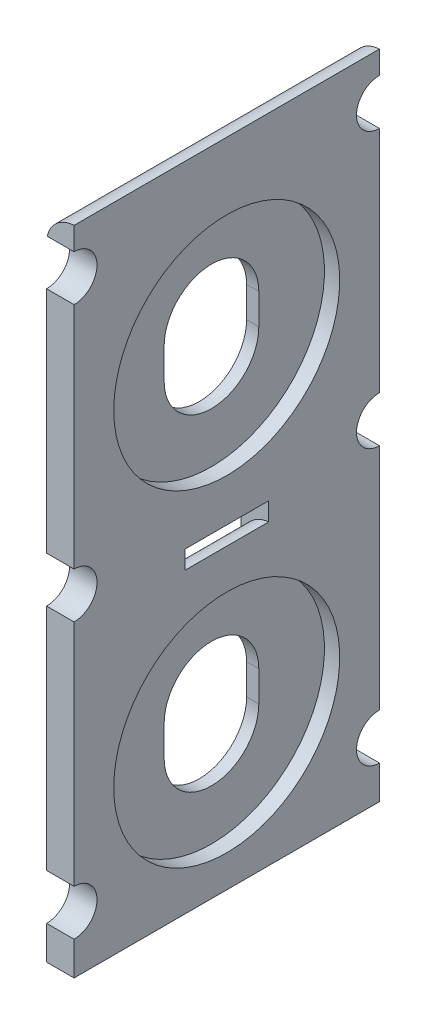
ISO-10303-21;
HEADER;
FILE_DESCRIPTION(('STEP AP214'),'2;1');
FILE_NAME('part.step','',(''),(''),'','','');
FILE_SCHEMA(('AUTOMOTIVE_DESIGN { 1 0 10303 214 1 1 1 1 }'));
ENDSEC;
DATA;
#1=APPLICATION_CONTEXT('core data for automotive mechanical design processes');
#2=APPLICATION_PROTOCOL_DEFINITION('international standard','automotive_design',2000,#1);
#3=PRODUCT_CONTEXT('',#1,'mechanical');
#4=PRODUCT('Part','Part','',(#3));
#5=PRODUCT_RELATED_PRODUCT_CATEGORY('part','',(#4));
#6=PRODUCT_DEFINITION_FORMATION('','',#4);
#7=PRODUCT_DEFINITION_CONTEXT('part definition',#1,'design');
#8=PRODUCT_DEFINITION('design','',#6,#7);
#9=PRODUCT_DEFINITION_SHAPE('','',#8);
#10=(LENGTH_UNIT() NAMED_UNIT(*) SI_UNIT(.MILLI.,.METRE.));
#11=(NAMED_UNIT(*) PLANE_ANGLE_UNIT() SI_UNIT($,.RADIAN.));
#12=(NAMED_UNIT(*) SI_UNIT($,.STERADIAN.) SOLID_ANGLE_UNIT());
#13=UNCERTAINTY_MEASURE_WITH_UNIT(LENGTH_MEASURE(1.E-05),#10,'distance_accuracy_value','');
#14=(GEOMETRIC_REPRESENTATION_CONTEXT(3) GLOBAL_UNCERTAINTY_ASSIGNED_CONTEXT((#13)) GLOBAL_UNIT_ASSIGNED_CONTEXT((#10,
#11,#12)) REPRESENTATION_CONTEXT('',''));
#15=CARTESIAN_POINT('',(0.,0.,0.));
#16=DIRECTION('',(0.,0.,1.));
#17=DIRECTION('',(1.,0.,0.));
#18=AXIS2_PLACEMENT_3D('',#15,#16,#17);
#19=CARTESIAN_POINT('',(24.7777685642343,171.879145763423,34.5));
#20=DIRECTION('',(0.,0.,-1.));
#21=DIRECTION('',(1.,0.,0.));
#22=AXIS2_PLACEMENT_3D('',#19,#20,#21);
#23=PLANE('',#22);
#24=DIRECTION('',(0.,1.,0.));
#25=VECTOR('',#24,1.);
#26=CARTESIAN_POINT('',(24.7777685642343,171.879145763423,34.5));
#27=LINE('',#26,#25);
#28=CARTESIAN_POINT('',(24.7777685642343,177.079145439853,34.5));
#29=VERTEX_POINT('',#28);
#30=CARTESIAN_POINT('',(24.7777685642343,192.079146086994,34.5));
#31=VERTEX_POINT('',#30);
#32=EDGE_CURVE('E358',#29,#31,#27,.T.);
#33=ORIENTED_EDGE('',*,*,#32,.F.);
#34=DIRECTION('',(-1.,0.,0.));
#35=VECTOR('',#34,1.);
#36=CARTESIAN_POINT('',(44.604632863947,177.079145439853,34.5));
#37=LINE('',#36,#35);
#38=CARTESIAN_POINT('',(22.9777685642343,177.079145439853,34.5));
#39=VERTEX_POINT('',#38);
#40=EDGE_CURVE('E433',#29,#39,#37,.T.);
#41=ORIENTED_EDGE('',*,*,#40,.T.);
#42=DIRECTION('',(0.,1.,0.));
#43=VECTOR('',#42,1.);
#44=CARTESIAN_POINT('',(22.9777685642343,171.879145763423,34.5));
#45=LINE('',#44,#43);
#46=CARTESIAN_POINT('',(22.9777685642343,192.079146086994,34.5));
#47=VERTEX_POINT('',#46);
#48=EDGE_CURVE('E364',#39,#47,#45,.T.);
#49=ORIENTED_EDGE('',*,*,#48,.T.);
#50=DIRECTION('',(-1.,0.,0.));
#51=VECTOR('',#50,1.);
#52=CARTESIAN_POINT('',(44.604632863947,192.079146086994,34.5));
#53=LINE('',#52,#51);
#54=EDGE_CURVE('E422',#47,#31,#53,.F.);
#55=ORIENTED_EDGE('',*,*,#54,.T.);
#56=EDGE_LOOP('',(#33,#41,#49,#55));
#57=FACE_BOUND('',#56,.T.);
#58=ADVANCED_FACE('F42',(#57),#23,.T.);
#59=CARTESIAN_POINT('',(24.7777685642343,195.079145439853,34.5));
#60=VERTEX_POINT('',#59);
#61=CARTESIAN_POINT('',(24.7777685642343,210.079146086994,34.5));
#62=VERTEX_POINT('',#61);
#63=EDGE_CURVE('E604',#60,#62,#27,.T.);
#64=ORIENTED_EDGE('',*,*,#63,.F.);
#65=DIRECTION('',(-1.,0.,0.));
#66=VECTOR('',#65,1.);
#67=CARTESIAN_POINT('',(44.604632863947,195.079145439853,34.5));
#68=LINE('',#67,#66);
#69=CARTESIAN_POINT('',(22.9777685642343,195.079145439853,34.5));
#70=VERTEX_POINT('',#69);
#71=EDGE_CURVE('E426',#60,#70,#68,.T.);
#72=ORIENTED_EDGE('',*,*,#71,.T.);
#73=CARTESIAN_POINT('',(22.9777685642343,210.079146086994,34.5));
#74=VERTEX_POINT('',#73);
#75=EDGE_CURVE('E365',#70,#74,#45,.T.);
#76=ORIENTED_EDGE('',*,*,#75,.T.);
#77=DIRECTION('',(-1.,0.,0.));
#78=VECTOR('',#77,1.);
#79=CARTESIAN_POINT('',(44.604632863947,210.079146086994,34.5));
#80=LINE('',#79,#78);
#81=EDGE_CURVE('E451',#74,#62,#80,.F.);
#82=ORIENTED_EDGE('',*,*,#81,.T.);
#83=EDGE_LOOP('',(#64,#72,#76,#82));
#84=FACE_BOUND('',#83,.T.);
#85=ADVANCED_FACE('F567',(#84),#23,.T.);
#86=CARTESIAN_POINT('',(24.7777685642343,213.079145439853,34.5));
#87=VERTEX_POINT('',#86);
#88=CARTESIAN_POINT('',(24.7777685642343,214.579145763423,34.5));
#89=VERTEX_POINT('',#88);
#90=EDGE_CURVE('E359',#87,#89,#27,.T.);
#91=ORIENTED_EDGE('',*,*,#90,.F.);
#92=DIRECTION('',(-1.,0.,0.));
#93=VECTOR('',#92,1.);
#94=CARTESIAN_POINT('',(44.604632863947,213.079145439853,34.5));
#95=LINE('',#94,#93);
#96=CARTESIAN_POINT('',(23.0197857749019,213.079145439853,34.5));
#97=VERTEX_POINT('',#96);
#98=EDGE_CURVE('E455',#87,#97,#95,.T.);
#99=ORIENTED_EDGE('',*,*,#98,.T.);
#100=CARTESIAN_POINT('',(24.8777685642343,212.681779167322,34.5));
#101=DIRECTION('',(0.,0.,1.));
#102=DIRECTION('',(1.,0.,0.));
#103=AXIS2_PLACEMENT_3D('',#100,#101,#102);
#104=CIRCLE('',#103,1.9);
#105=EDGE_CURVE('E479',#89,#97,#104,.T.);
#106=ORIENTED_EDGE('',*,*,#105,.F.);
#107=EDGE_LOOP('',(#91,#99,#106));
#108=FACE_BOUND('',#107,.T.);
#109=ADVANCED_FACE('F574',(#108),#23,.T.);
#110=CARTESIAN_POINT('',(24.7777685642343,171.879145763423,54.5));
#111=DIRECTION('',(0.,0.,1.));
#112=DIRECTION('',(-1.,0.,0.));
#113=AXIS2_PLACEMENT_3D('',#110,#111,#112);
#114=PLANE('',#113);
#115=DIRECTION('',(0.,1.,0.));
#116=VECTOR('',#115,1.);
#117=CARTESIAN_POINT('',(24.7777685642343,171.879145763423,54.5));
#118=LINE('',#117,#116);
#119=CARTESIAN_POINT('',(24.7777685642343,171.879145763423,54.5));
#120=VERTEX_POINT('',#119);
#121=CARTESIAN_POINT('',(24.7777685642343,174.079146086994,54.5));
#122=VERTEX_POINT('',#121);
#123=EDGE_CURVE('E372',#120,#122,#118,.T.);
#124=ORIENTED_EDGE('',*,*,#123,.T.);
#125=DIRECTION('',(-1.,0.,0.));
#126=VECTOR('',#125,1.);
#127=CARTESIAN_POINT('',(44.604632863947,174.079146086994,54.5));
#128=LINE('',#127,#126);
#129=CARTESIAN_POINT('',(22.9777685642343,174.079146086994,54.5));
#130=VERTEX_POINT('',#129);
#131=EDGE_CURVE('E388',#122,#130,#128,.T.);
#132=ORIENTED_EDGE('',*,*,#131,.T.);
#133=DIRECTION('',(0.,1.,0.));
#134=VECTOR('',#133,1.);
#135=CARTESIAN_POINT('',(22.9777685642343,171.879145763423,54.5));
#136=LINE('',#135,#134);
#137=CARTESIAN_POINT('',(22.9777685642343,171.879145763423,54.5));
#138=VERTEX_POINT('',#137);
#139=EDGE_CURVE('E366',#138,#130,#136,.T.);
#140=ORIENTED_EDGE('',*,*,#139,.F.);
#141=DIRECTION('',(-1.,0.,0.));
#142=VECTOR('',#141,1.);
#143=CARTESIAN_POINT('',(24.7777685642343,171.879145763423,54.5));
#144=LINE('',#143,#142);
#145=EDGE_CURVE('E339',#120,#138,#144,.T.);
#146=ORIENTED_EDGE('',*,*,#145,.F.);
#147=EDGE_LOOP('',(#124,#132,#140,#146));
#148=FACE_BOUND('',#147,.T.);
#149=ADVANCED_FACE('F590',(#148),#114,.T.);
#150=CARTESIAN_POINT('',(22.9777685642343,177.079145439853,54.5));
#151=VERTEX_POINT('',#150);
#152=CARTESIAN_POINT('',(22.9777685642343,192.079146086994,54.5));
#153=VERTEX_POINT('',#152);
#154=EDGE_CURVE('E370',#151,#153,#136,.T.);
#155=ORIENTED_EDGE('',*,*,#154,.F.);
#156=DIRECTION('',(-1.,0.,0.));
#157=VECTOR('',#156,1.);
#158=CARTESIAN_POINT('',(44.604632863947,177.079145439853,54.5));
#159=LINE('',#158,#157);
#160=CARTESIAN_POINT('',(24.7777685642343,177.079145439853,54.5));
#161=VERTEX_POINT('',#160);
#162=EDGE_CURVE('E384',#151,#161,#159,.F.);
#163=ORIENTED_EDGE('',*,*,#162,.T.);
#164=CARTESIAN_POINT('',(24.7777685642343,192.079146086994,54.5));
#165=VERTEX_POINT('',#164);
#166=EDGE_CURVE('E376',#161,#165,#118,.T.);
#167=ORIENTED_EDGE('',*,*,#166,.T.);
#168=DIRECTION('',(-1.,0.,0.));
#169=VECTOR('',#168,1.);
#170=CARTESIAN_POINT('',(44.604632863947,192.079146086994,54.5));
#171=LINE('',#170,#169);
#172=EDGE_CURVE('E380',#165,#153,#171,.T.);
#173=ORIENTED_EDGE('',*,*,#172,.T.);
#174=EDGE_LOOP('',(#155,#163,#167,#173));
#175=FACE_BOUND('',#174,.T.);
#176=ADVANCED_FACE('F595',(#175),#114,.T.);
#177=CARTESIAN_POINT('',(22.9777685642343,195.079145439853,54.5));
#178=VERTEX_POINT('',#177);
#179=CARTESIAN_POINT('',(22.9777685642343,210.079146086994,54.5));
#180=VERTEX_POINT('',#179);
#181=EDGE_CURVE('E371',#178,#180,#136,.T.);
#182=ORIENTED_EDGE('',*,*,#181,.F.);
#183=DIRECTION('',(-1.,0.,0.));
#184=VECTOR('',#183,1.);
#185=CARTESIAN_POINT('',(44.604632863947,195.079145439853,54.5));
#186=LINE('',#185,#184);
#187=CARTESIAN_POINT('',(24.7777685642343,195.079145439853,54.5));
#188=VERTEX_POINT('',#187);
#189=EDGE_CURVE('E357',#178,#188,#186,.F.);
#190=ORIENTED_EDGE('',*,*,#189,.T.);
#191=CARTESIAN_POINT('',(24.7777685642343,210.079146086994,54.5));
#192=VERTEX_POINT('',#191);
#193=EDGE_CURVE('E632',#188,#192,#118,.T.);
#194=ORIENTED_EDGE('',*,*,#193,.T.);
#195=DIRECTION('',(-1.,0.,0.));
#196=VECTOR('',#195,1.);
#197=CARTESIAN_POINT('',(44.604632863947,210.079146086994,54.5));
#198=LINE('',#197,#196);
#199=EDGE_CURVE('E447',#192,#180,#198,.T.);
#200=ORIENTED_EDGE('',*,*,#199,.T.);
#201=EDGE_LOOP('',(#182,#190,#194,#200));
#202=FACE_BOUND('',#201,.T.);
#203=ADVANCED_FACE('F586',(#202),#114,.T.);
#204=CARTESIAN_POINT('',(24.7777685642343,171.879145763423,54.5));
#205=DIRECTION('',(1.,0.,0.));
#206=DIRECTION('',(0.,0.,1.));
#207=AXIS2_PLACEMENT_3D('',#204,#205,#206);
#208=PLANE('',#207);
#209=CARTESIAN_POINT('',(24.7777685642343,181.379145763423,44.5));
#210=DIRECTION('',(-1.,0.,0.));
#211=DIRECTION('',(0.,0.,1.));
#212=AXIS2_PLACEMENT_3D('',#209,#210,#211);
#213=CIRCLE('',#212,7.4);
#214=CARTESIAN_POINT('',(24.7777685642343,181.379145763423,51.9));
#215=VERTEX_POINT('',#214);
#216=EDGE_CURVE('E301',#215,#215,#213,.T.);
#217=ORIENTED_EDGE('',*,*,#216,.T.);
#218=EDGE_LOOP('',(#217));
#219=FACE_BOUND('',#218,.T.);
#220=CARTESIAN_POINT('',(24.7777685642343,202.779145763423,44.5));
#221=DIRECTION('',(-1.,0.,0.));
#222=DIRECTION('',(0.,0.,1.));
#223=AXIS2_PLACEMENT_3D('',#220,#221,#222);
#224=CIRCLE('',#223,7.4);
#225=CARTESIAN_POINT('',(24.7777685642343,202.779145763423,51.9));
#226=VERTEX_POINT('',#225);
#227=EDGE_CURVE('E267',#226,#226,#224,.T.);
#228=ORIENTED_EDGE('',*,*,#227,.T.);
#229=EDGE_LOOP('',(#228));
#230=FACE_BOUND('',#229,.T.);
#231=DIRECTION('',(0.,1.,0.));
#232=VECTOR('',#231,1.);
#233=CARTESIAN_POINT('',(24.7777685642343,171.879145763423,47.25));
#234=LINE('',#233,#232);
#235=CARTESIAN_POINT('',(24.7777685642343,191.379145763423,47.25));
#236=VERTEX_POINT('',#235);
#237=CARTESIAN_POINT('',(24.7777685642343,192.579145763423,47.25));
#238=VERTEX_POINT('',#237);
#239=EDGE_CURVE('E331',#236,#238,#234,.T.);
#240=ORIENTED_EDGE('',*,*,#239,.T.);
#241=DIRECTION('',(0.,0.,-1.));
#242=VECTOR('',#241,1.);
#243=CARTESIAN_POINT('',(24.7777685642343,192.579145763423,54.5));
#244=LINE('',#243,#242);
#245=CARTESIAN_POINT('',(24.7777685642343,192.579145763423,41.75));
#246=VERTEX_POINT('',#245);
#247=EDGE_CURVE('E327',#238,#246,#244,.T.);
#248=ORIENTED_EDGE('',*,*,#247,.T.);
#249=DIRECTION('',(0.,-1.,0.));
#250=VECTOR('',#249,1.);
#251=CARTESIAN_POINT('',(24.7777685642343,171.879145763423,41.7500000000001));
#252=LINE('',#251,#250);
#253=CARTESIAN_POINT('',(24.7777685642343,191.379145763423,41.75));
#254=VERTEX_POINT('',#253);
#255=EDGE_CURVE('E323',#246,#254,#252,.T.);
#256=ORIENTED_EDGE('',*,*,#255,.T.);
#257=DIRECTION('',(0.,0.,1.));
#258=VECTOR('',#257,1.);
#259=CARTESIAN_POINT('',(24.7777685642343,191.379145763423,54.5));
#260=LINE('',#259,#258);
#261=EDGE_CURVE('E319',#254,#236,#260,.T.);
#262=ORIENTED_EDGE('',*,*,#261,.T.);
#263=EDGE_LOOP('',(#240,#248,#256,#262));
#264=FACE_BOUND('',#263,.T.);
#265=CARTESIAN_POINT('',(24.7777685642343,171.879145763423,34.5));
#266=VERTEX_POINT('',#265);
#267=CARTESIAN_POINT('',(24.7777685642343,174.079146086994,34.5));
#268=VERTEX_POINT('',#267);
#269=EDGE_CURVE('E353',#266,#268,#27,.T.);
#270=ORIENTED_EDGE('',*,*,#269,.T.);
#271=CARTESIAN_POINT('',(24.7777685642343,175.579145763423,34.4990147532425));
#272=DIRECTION('',(-1.,0.,0.));
#273=DIRECTION('',(0.,0.,1.));
#274=AXIS2_PLACEMENT_3D('',#271,#272,#273);
#275=CIRCLE('',#274,1.5);
#276=EDGE_CURVE('E419',#268,#29,#275,.T.);
#277=ORIENTED_EDGE('',*,*,#276,.T.);
#278=ORIENTED_EDGE('',*,*,#32,.T.);
#279=CARTESIAN_POINT('',(24.7777685642343,193.579145763423,34.4990147532425));
#280=DIRECTION('',(-1.,0.,0.));
#281=DIRECTION('',(0.,0.,1.));
#282=AXIS2_PLACEMENT_3D('',#279,#280,#281);
#283=CIRCLE('',#282,1.5);
#284=EDGE_CURVE('E413',#31,#60,#283,.T.);
#285=ORIENTED_EDGE('',*,*,#284,.T.);
#286=ORIENTED_EDGE('',*,*,#63,.T.);
#287=CARTESIAN_POINT('',(24.7777685642343,211.579145763423,34.4990147532425));
#288=DIRECTION('',(-1.,0.,0.));
#289=DIRECTION('',(0.,0.,1.));
#290=AXIS2_PLACEMENT_3D('',#287,#288,#289);
#291=CIRCLE('',#290,1.5);
#292=EDGE_CURVE('E410',#62,#87,#291,.T.);
#293=ORIENTED_EDGE('',*,*,#292,.T.);
#294=ORIENTED_EDGE('',*,*,#90,.T.);
#295=DIRECTION('',(0.,0.,1.));
#296=VECTOR('',#295,1.);
#297=CARTESIAN_POINT('',(24.7777685642343,214.579145763423,54.5));
#298=LINE('',#297,#296);
#299=CARTESIAN_POINT('',(24.7777685642343,214.579145763423,54.5));
#300=VERTEX_POINT('',#299);
#301=EDGE_CURVE('E335',#89,#300,#298,.T.);
#302=ORIENTED_EDGE('',*,*,#301,.T.);
#303=CARTESIAN_POINT('',(24.7777685642343,213.079145439853,54.5));
#304=VERTEX_POINT('',#303);
#305=EDGE_CURVE('E349',#304,#300,#118,.T.);
#306=ORIENTED_EDGE('',*,*,#305,.F.);
#307=CARTESIAN_POINT('',(24.7777685642343,211.579145763423,54.4990147532425));
#308=DIRECTION('',(-1.,0.,0.));
#309=DIRECTION('',(0.,0.,1.));
#310=AXIS2_PLACEMENT_3D('',#307,#308,#309);
#311=CIRCLE('',#310,1.5);
#312=EDGE_CURVE('E444',#304,#192,#311,.T.);
#313=ORIENTED_EDGE('',*,*,#312,.T.);
#314=ORIENTED_EDGE('',*,*,#193,.F.);
#315=CARTESIAN_POINT('',(24.7777685642343,193.579145763423,54.4990147532425));
#316=DIRECTION('',(-1.,0.,0.));
#317=DIRECTION('',(0.,0.,1.));
#318=AXIS2_PLACEMENT_3D('',#315,#316,#317);
#319=CIRCLE('',#318,1.5);
#320=EDGE_CURVE('E407',#188,#165,#319,.T.);
#321=ORIENTED_EDGE('',*,*,#320,.T.);
#322=ORIENTED_EDGE('',*,*,#166,.F.);
#323=CARTESIAN_POINT('',(24.7777685642343,175.579145763423,54.4990147532425));
#324=DIRECTION('',(-1.,0.,0.));
#325=DIRECTION('',(0.,0.,1.));
#326=AXIS2_PLACEMENT_3D('',#323,#324,#325);
#327=CIRCLE('',#326,1.5);
#328=EDGE_CURVE('E416',#161,#122,#327,.T.);
#329=ORIENTED_EDGE('',*,*,#328,.T.);
#330=ORIENTED_EDGE('',*,*,#123,.F.);
#331=DIRECTION('',(0.,0.,1.));
#332=VECTOR('',#331,1.);
#333=CARTESIAN_POINT('',(24.7777685642343,171.879145763423,54.5));
#334=LINE('',#333,#332);
#335=EDGE_CURVE('E336',#266,#120,#334,.T.);
#336=ORIENTED_EDGE('',*,*,#335,.F.);
#337=EDGE_LOOP('',(#270,#277,#278,#285,#286,#293,#294,#302,#306,#313,#314,#321,#322,#329,#330,#336));
#338=FACE_BOUND('',#337,.T.);
#339=ADVANCED_FACE('F580',(#219,#230,#264,#338),#208,.T.);
#340=CARTESIAN_POINT('',(22.9777685642343,171.879145763423,34.5));
#341=VERTEX_POINT('',#340);
#342=CARTESIAN_POINT('',(22.9777685642343,174.079146086994,34.5));
#343=VERTEX_POINT('',#342);
#344=EDGE_CURVE('E360',#341,#343,#45,.T.);
#345=ORIENTED_EDGE('',*,*,#344,.T.);
#346=DIRECTION('',(-1.,0.,0.));
#347=VECTOR('',#346,1.);
#348=CARTESIAN_POINT('',(44.604632863947,174.079146086994,34.5));
#349=LINE('',#348,#347);
#350=EDGE_CURVE('E430',#343,#268,#349,.F.);
#351=ORIENTED_EDGE('',*,*,#350,.T.);
#352=ORIENTED_EDGE('',*,*,#269,.F.);
#353=DIRECTION('',(1.,0.,0.));
#354=VECTOR('',#353,1.);
#355=CARTESIAN_POINT('',(24.7777685642343,171.879145763423,34.5));
#356=LINE('',#355,#354);
#357=EDGE_CURVE('E346',#341,#266,#356,.T.);
#358=ORIENTED_EDGE('',*,*,#357,.F.);
#359=EDGE_LOOP('',(#345,#351,#352,#358));
#360=FACE_BOUND('',#359,.T.);
#361=ADVANCED_FACE('F570',(#360),#23,.T.);
#362=CARTESIAN_POINT('',(22.9777685642343,171.879145763423,54.5));
#363=DIRECTION('',(-1.,0.,0.));
#364=DIRECTION('',(0.,0.,-1.));
#365=AXIS2_PLACEMENT_3D('',#362,#363,#364);
#366=PLANE('',#365);
#367=CARTESIAN_POINT('',(22.9777685642343,203.779145763423,44.5));
#368=DIRECTION('',(1.,0.,0.));
#369=DIRECTION('',(0.,0.,-1.));
#370=AXIS2_PLACEMENT_3D('',#367,#368,#369);
#371=CIRCLE('',#370,3.10000000000001);
#372=CARTESIAN_POINT('',(22.9777685642343,203.779145763423,41.4));
#373=VERTEX_POINT('',#372);
#374=CARTESIAN_POINT('',(22.9777685642343,203.779145763423,47.6));
#375=VERTEX_POINT('',#374);
#376=EDGE_CURVE('E12',#373,#375,#371,.T.);
#377=ORIENTED_EDGE('',*,*,#376,.T.);
#378=DIRECTION('',(0.,-1.,0.));
#379=VECTOR('',#378,1.);
#380=CARTESIAN_POINT('',(22.9777685642343,171.879145763423,47.6));
#381=LINE('',#380,#379);
#382=CARTESIAN_POINT('',(22.9777685642343,201.779145763423,47.6));
#383=VERTEX_POINT('',#382);
#384=EDGE_CURVE('E52',#375,#383,#381,.T.);
#385=ORIENTED_EDGE('',*,*,#384,.T.);
#386=CARTESIAN_POINT('',(22.9777685642343,201.779145763423,44.5));
#387=DIRECTION('',(1.,0.,0.));
#388=DIRECTION('',(0.,0.,-1.));
#389=AXIS2_PLACEMENT_3D('',#386,#387,#388);
#390=CIRCLE('',#389,3.10000000000001);
#391=CARTESIAN_POINT('',(22.9777685642343,201.779145763423,41.4));
#392=VERTEX_POINT('',#391);
#393=EDGE_CURVE('E546',#383,#392,#390,.T.);
#394=ORIENTED_EDGE('',*,*,#393,.T.);
#395=DIRECTION('',(0.,1.,0.));
#396=VECTOR('',#395,1.);
#397=CARTESIAN_POINT('',(22.9777685642343,171.879145763423,41.4));
#398=LINE('',#397,#396);
#399=EDGE_CURVE('E543',#392,#373,#398,.T.);
#400=ORIENTED_EDGE('',*,*,#399,.T.);
#401=EDGE_LOOP('',(#377,#385,#394,#400));
#402=FACE_BOUND('',#401,.T.);
#403=CARTESIAN_POINT('',(22.9777685642343,182.379145763423,44.5));
#404=DIRECTION('',(1.,0.,0.));
#405=DIRECTION('',(0.,0.,-1.));
#406=AXIS2_PLACEMENT_3D('',#403,#404,#405);
#407=CIRCLE('',#406,3.1);
#408=CARTESIAN_POINT('',(22.9777685642343,182.379145763423,41.4));
#409=VERTEX_POINT('',#408);
#410=CARTESIAN_POINT('',(22.9777685642343,182.379145763423,47.6));
#411=VERTEX_POINT('',#410);
#412=EDGE_CURVE('E539',#409,#411,#407,.T.);
#413=ORIENTED_EDGE('',*,*,#412,.T.);
#414=DIRECTION('',(0.,-1.,0.));
#415=VECTOR('',#414,1.);
#416=CARTESIAN_POINT('',(22.9777685642343,171.879145763423,47.6));
#417=LINE('',#416,#415);
#418=CARTESIAN_POINT('',(22.9777685642343,180.379145763423,47.6));
#419=VERTEX_POINT('',#418);
#420=EDGE_CURVE('E535',#411,#419,#417,.T.);
#421=ORIENTED_EDGE('',*,*,#420,.T.);
#422=CARTESIAN_POINT('',(22.9777685642343,180.379145763423,44.5));
#423=DIRECTION('',(1.,0.,0.));
#424=DIRECTION('',(0.,0.,-1.));
#425=AXIS2_PLACEMENT_3D('',#422,#423,#424);
#426=CIRCLE('',#425,3.1);
#427=CARTESIAN_POINT('',(22.9777685642343,180.379145763423,41.4));
#428=VERTEX_POINT('',#427);
#429=EDGE_CURVE('E531',#419,#428,#426,.T.);
#430=ORIENTED_EDGE('',*,*,#429,.T.);
#431=DIRECTION('',(0.,1.,0.));
#432=VECTOR('',#431,1.);
#433=CARTESIAN_POINT('',(22.9777685642343,171.879145763423,41.4));
#434=LINE('',#433,#432);
#435=EDGE_CURVE('E527',#428,#409,#434,.T.);
#436=ORIENTED_EDGE('',*,*,#435,.T.);
#437=EDGE_LOOP('',(#413,#421,#430,#436));
#438=FACE_BOUND('',#437,.T.);
#439=DIRECTION('',(0.,-1.,0.));
#440=VECTOR('',#439,1.);
#441=CARTESIAN_POINT('',(22.9777685642343,191.379145763423,47.25));
#442=LINE('',#441,#440);
#443=CARTESIAN_POINT('',(22.9777685642343,194.569120637636,47.25));
#444=VERTEX_POINT('',#443);
#445=CARTESIAN_POINT('',(22.9777685642343,189.38917088921,47.25));
#446=VERTEX_POINT('',#445);
#447=EDGE_CURVE('E300',#444,#446,#442,.T.);
#448=ORIENTED_EDGE('',*,*,#447,.T.);
#449=DIRECTION('',(0.,0.,1.));
#450=VECTOR('',#449,1.);
#451=CARTESIAN_POINT('',(22.9777685642343,189.38917088921,47.25));
#452=LINE('',#451,#450);
#453=CARTESIAN_POINT('',(22.9777685642343,189.38917088921,41.75));
#454=VERTEX_POINT('',#453);
#455=EDGE_CURVE('E459',#454,#446,#452,.T.);
#456=ORIENTED_EDGE('',*,*,#455,.F.);
#457=DIRECTION('',(0.,1.,0.));
#458=VECTOR('',#457,1.);
#459=CARTESIAN_POINT('',(22.9777685642343,191.379145763423,41.75));
#460=LINE('',#459,#458);
#461=CARTESIAN_POINT('',(22.9777685642343,194.569120637636,41.75));
#462=VERTEX_POINT('',#461);
#463=EDGE_CURVE('E315',#454,#462,#460,.T.);
#464=ORIENTED_EDGE('',*,*,#463,.T.);
#465=DIRECTION('',(0.,0.,-1.));
#466=VECTOR('',#465,1.);
#467=CARTESIAN_POINT('',(22.9777685642343,194.569120637636,41.75));
#468=LINE('',#467,#466);
#469=EDGE_CURVE('E463',#444,#462,#468,.T.);
#470=ORIENTED_EDGE('',*,*,#469,.F.);
#471=EDGE_LOOP('',(#448,#456,#464,#470));
#472=FACE_BOUND('',#471,.T.);
#473=CARTESIAN_POINT('',(22.9777685642343,211.579145763423,34.4990147532425));
#474=DIRECTION('',(1.,0.,0.));
#475=DIRECTION('',(0.,0.,-1.));
#476=AXIS2_PLACEMENT_3D('',#473,#474,#475);
#477=CIRCLE('',#476,1.5);
#478=CARTESIAN_POINT('',(22.9777685642343,212.681779167322,35.5159707879884));
#479=VERTEX_POINT('',#478);
#480=EDGE_CURVE('E395',#479,#74,#477,.T.);
#481=ORIENTED_EDGE('',*,*,#480,.T.);
#482=ORIENTED_EDGE('',*,*,#75,.F.);
#483=CARTESIAN_POINT('',(22.9777685642343,193.579145763423,34.4990147532425));
#484=DIRECTION('',(1.,0.,0.));
#485=DIRECTION('',(0.,0.,-1.));
#486=AXIS2_PLACEMENT_3D('',#483,#484,#485);
#487=CIRCLE('',#486,1.5);
#488=EDGE_CURVE('E398',#70,#47,#487,.T.);
#489=ORIENTED_EDGE('',*,*,#488,.T.);
#490=ORIENTED_EDGE('',*,*,#48,.F.);
#491=CARTESIAN_POINT('',(22.9777685642343,175.579145763423,34.4990147532425));
#492=DIRECTION('',(1.,0.,0.));
#493=DIRECTION('',(0.,0.,-1.));
#494=AXIS2_PLACEMENT_3D('',#491,#492,#493);
#495=CIRCLE('',#494,1.5);
#496=EDGE_CURVE('E404',#39,#343,#495,.T.);
#497=ORIENTED_EDGE('',*,*,#496,.T.);
#498=ORIENTED_EDGE('',*,*,#344,.F.);
#499=DIRECTION('',(0.,0.,-1.));
#500=VECTOR('',#499,1.);
#501=CARTESIAN_POINT('',(22.9777685642343,171.879145763423,54.5));
#502=LINE('',#501,#500);
#503=EDGE_CURVE('E343',#138,#341,#502,.T.);
#504=ORIENTED_EDGE('',*,*,#503,.F.);
#505=ORIENTED_EDGE('',*,*,#139,.T.);
#506=CARTESIAN_POINT('',(22.9777685642343,175.579145763423,54.4990147532425));
#507=DIRECTION('',(1.,0.,0.));
#508=DIRECTION('',(0.,0.,-1.));
#509=AXIS2_PLACEMENT_3D('',#506,#507,#508);
#510=CIRCLE('',#509,1.5);
#511=EDGE_CURVE('E401',#130,#151,#510,.T.);
#512=ORIENTED_EDGE('',*,*,#511,.T.);
#513=ORIENTED_EDGE('',*,*,#154,.T.);
#514=CARTESIAN_POINT('',(22.9777685642343,193.579145763423,54.4990147532425));
#515=DIRECTION('',(1.,0.,0.));
#516=DIRECTION('',(0.,0.,-1.));
#517=AXIS2_PLACEMENT_3D('',#514,#515,#516);
#518=CIRCLE('',#517,1.5);
#519=EDGE_CURVE('E392',#153,#178,#518,.T.);
#520=ORIENTED_EDGE('',*,*,#519,.T.);
#521=ORIENTED_EDGE('',*,*,#181,.T.);
#522=CARTESIAN_POINT('',(22.9777685642343,211.579145763423,54.4990147532425));
#523=DIRECTION('',(1.,0.,0.));
#524=DIRECTION('',(0.,0.,-1.));
#525=AXIS2_PLACEMENT_3D('',#522,#523,#524);
#526=CIRCLE('',#525,1.5);
#527=CARTESIAN_POINT('',(22.9777685642343,212.681779167322,53.4820587184965));
#528=VERTEX_POINT('',#527);
#529=EDGE_CURVE('E440',#180,#528,#526,.T.);
#530=ORIENTED_EDGE('',*,*,#529,.T.);
#531=DIRECTION('',(0.,0.,1.));
#532=VECTOR('',#531,1.);
#533=CARTESIAN_POINT('',(22.9777685642343,212.681779167322,54.5));
#534=LINE('',#533,#532);
#535=EDGE_CURVE('E491',#479,#528,#534,.T.);
#536=ORIENTED_EDGE('',*,*,#535,.F.);
#537=EDGE_LOOP('',(#481,#482,#489,#490,#497,#498,#504,#505,#512,#513,#520,#521,#530,#536));
#538=FACE_BOUND('',#537,.T.);
#539=ADVANCED_FACE('F553',(#402,#438,#472,#538),#366,.T.);
#540=DIRECTION('',(-1.,0.,0.));
#541=VECTOR('',#540,1.);
#542=CARTESIAN_POINT('',(44.604632863947,213.079145439853,54.5));
#543=LINE('',#542,#541);
#544=CARTESIAN_POINT('',(23.0197857749019,213.079145439853,54.5));
#545=VERTEX_POINT('',#544);
#546=EDGE_CURVE('E437',#545,#304,#543,.F.);
#547=ORIENTED_EDGE('',*,*,#546,.T.);
#548=ORIENTED_EDGE('',*,*,#305,.T.);
#549=CARTESIAN_POINT('',(24.8777685642343,212.681779167322,54.5));
#550=DIRECTION('',(0.,0.,-1.));
#551=DIRECTION('',(-1.,0.,0.));
#552=AXIS2_PLACEMENT_3D('',#549,#550,#551);
#553=CIRCLE('',#552,1.9);
#554=EDGE_CURVE('E524',#545,#300,#553,.T.);
#555=ORIENTED_EDGE('',*,*,#554,.F.);
#556=EDGE_LOOP('',(#547,#548,#555));
#557=FACE_BOUND('',#556,.T.);
#558=ADVANCED_FACE('F514',(#557),#114,.T.);
#559=CARTESIAN_POINT('',(44.604632863947,211.579145763423,54.4990147532425));
#560=DIRECTION('',(-1.,0.,0.));
#561=DIRECTION('',(0.,0.,-1.));
#562=AXIS2_PLACEMENT_3D('',#559,#560,#561);
#563=CYLINDRICAL_SURFACE('',#562,1.5);
#564=ORIENTED_EDGE('',*,*,#529,.F.);
#565=ORIENTED_EDGE('',*,*,#199,.F.);
#566=ORIENTED_EDGE('',*,*,#312,.F.);
#567=ORIENTED_EDGE('',*,*,#546,.F.);
#568=CARTESIAN_POINT('',(22.9777685642343,212.681779167322,53.4820587184965));
#569=CARTESIAN_POINT('',(22.9777699192991,212.710218100679,53.5128934074765));
#570=CARTESIAN_POINT('',(22.9784067049005,212.737342765382,53.5449002853066));
#571=CARTESIAN_POINT('',(22.9806100740966,212.788798587437,53.6110414922875));
#572=CARTESIAN_POINT('',(22.9821763697216,212.813130607188,53.6451751596118));
#573=CARTESIAN_POINT('',(22.9877615484667,212.881747051827,53.7505191719411));
#574=CARTESIAN_POINT('',(22.9926657867655,212.921612391229,53.8246296339095));
#575=CARTESIAN_POINT('',(23.0023678157195,212.988401092128,53.9783993409905));
#576=CARTESIAN_POINT('',(23.0071656190101,213.015325997771,54.0580579227628));
#577=CARTESIAN_POINT('',(23.0147647145035,213.055466563211,54.2207095358986));
#578=CARTESIAN_POINT('',(23.0175715103303,213.068720060562,54.3036927002607));
#579=CARTESIAN_POINT('',(23.0191950843658,213.076371585993,54.4058868814298));
#580=CARTESIAN_POINT('',(23.0194184177348,213.077422797788,54.4247017699696));
#581=CARTESIAN_POINT('',(23.0197146470461,213.078815068067,54.4623423711247));
#582=CARTESIAN_POINT('',(23.0197876756348,213.079156752724,54.4811680595173));
#583=CARTESIAN_POINT('',(23.0197857749019,213.079145439853,54.5));
#584=B_SPLINE_CURVE_WITH_KNOTS('',3,(#568,#569,#570,#571,#572,#573,#574,#575,#576,#577,#578,
#579,#580,#581,#582,#583),.UNSPECIFIED.,.F.,.F.,(4,2,2,2,2,2,2,4),(0.,0.125746218686393,
0.251453500510068,0.503040677432547,0.75459782573718,1.00545687079615,1.06198614670468,
1.11846551317031),.UNSPECIFIED.);
#585=EDGE_CURVE('E517',#528,#545,#584,.T.);
#586=ORIENTED_EDGE('',*,*,#585,.F.);
#587=EDGE_LOOP('',(#564,#565,#566,#567,#586));
#588=FACE_BOUND('',#587,.T.);
#589=ADVANCED_FACE('F509',(#588),#563,.F.);
#590=CARTESIAN_POINT('',(44.604632863947,193.579145763423,54.4990147532425));
#591=DIRECTION('',(-1.,0.,0.));
#592=DIRECTION('',(0.,0.,-1.));
#593=AXIS2_PLACEMENT_3D('',#590,#591,#592);
#594=CYLINDRICAL_SURFACE('',#593,1.5);
#595=ORIENTED_EDGE('',*,*,#320,.F.);
#596=ORIENTED_EDGE('',*,*,#189,.F.);
#597=ORIENTED_EDGE('',*,*,#519,.F.);
#598=ORIENTED_EDGE('',*,*,#172,.F.);
#599=EDGE_LOOP('',(#595,#596,#597,#598));
#600=FACE_BOUND('',#599,.T.);
#601=ADVANCED_FACE('F499',(#600),#594,.F.);
#602=CARTESIAN_POINT('',(44.604632863947,211.579145763423,34.4990147532425));
#603=DIRECTION('',(-1.,0.,0.));
#604=DIRECTION('',(0.,0.,-1.));
#605=AXIS2_PLACEMENT_3D('',#602,#603,#604);
#606=CYLINDRICAL_SURFACE('',#605,1.5);
#607=ORIENTED_EDGE('',*,*,#98,.F.);
#608=ORIENTED_EDGE('',*,*,#292,.F.);
#609=ORIENTED_EDGE('',*,*,#81,.F.);
#610=ORIENTED_EDGE('',*,*,#480,.F.);
#611=CARTESIAN_POINT('',(23.0197857749019,213.079145439853,34.5));
#612=CARTESIAN_POINT('',(23.0197916825756,213.079122550442,34.5419500025112));
#613=CARTESIAN_POINT('',(23.0193978919037,213.077330644713,34.5838953194296));
#614=CARTESIAN_POINT('',(23.0178981962042,213.070245273428,34.667469595642));
#615=CARTESIAN_POINT('',(23.0167924111633,213.064952397857,34.7090986070447));
#616=CARTESIAN_POINT('',(23.0139541733437,213.050892715334,34.7917994587048));
#617=CARTESIAN_POINT('',(23.0122209362422,213.042121559172,34.8328705345738));
#618=CARTESIAN_POINT('',(23.0082981842431,213.021179929415,34.914102976591));
#619=CARTESIAN_POINT('',(23.006108677204,213.009009514366,34.954264358394));
#620=CARTESIAN_POINT('',(22.9991650535799,212.967519810225,35.0729795038703));
#621=CARTESIAN_POINT('',(22.9940332686232,212.933211898544,35.1498235849744));
#622=CARTESIAN_POINT('',(22.9850020487284,212.852287388895,35.2965772388314));
#623=CARTESIAN_POINT('',(22.9810991692359,212.805705879576,35.3665058105639));
#624=CARTESIAN_POINT('',(22.9786950767089,212.742205137597,35.4464505798399));
#625=CARTESIAN_POINT('',(22.9783548442551,212.7304750039,35.4606704828373));
#626=CARTESIAN_POINT('',(22.9778916950547,212.706506902594,35.488658630488));
#627=CARTESIAN_POINT('',(22.9777685967569,212.694269368006,35.5024272430126));
#628=CARTESIAN_POINT('',(22.9777685642343,212.681779167322,35.5159707879884));
#629=B_SPLINE_CURVE_WITH_KNOTS('',3,(#611,#612,#613,#614,#615,#616,#617,#618,#619,#620,#621,
#622,#623,#624,#625,#626,#627,#628),.UNSPECIFIED.,.F.,.F.,(4,2,2,2,2,2,2,2,4),(0.,
0.125805267867127,0.251589340338274,0.377531190456683,0.503470871604998,0.755171829620323,
1.00616087056699,1.06146320734194,1.11671928252865),.UNSPECIFIED.);
#630=EDGE_CURVE('E483',#97,#479,#629,.T.);
#631=ORIENTED_EDGE('',*,*,#630,.F.);
#632=EDGE_LOOP('',(#607,#608,#609,#610,#631));
#633=FACE_BOUND('',#632,.T.);
#634=ADVANCED_FACE('F493',(#633),#606,.F.);
#635=CARTESIAN_POINT('',(44.604632863947,193.579145763423,34.4990147532425));
#636=DIRECTION('',(-1.,0.,0.));
#637=DIRECTION('',(0.,0.,-1.));
#638=AXIS2_PLACEMENT_3D('',#635,#636,#637);
#639=CYLINDRICAL_SURFACE('',#638,1.5);
#640=ORIENTED_EDGE('',*,*,#54,.F.);
#641=ORIENTED_EDGE('',*,*,#488,.F.);
#642=ORIENTED_EDGE('',*,*,#71,.F.);
#643=ORIENTED_EDGE('',*,*,#284,.F.);
#644=EDGE_LOOP('',(#640,#641,#642,#643));
#645=FACE_BOUND('',#644,.T.);
#646=ADVANCED_FACE('F498',(#645),#639,.F.);
#647=CARTESIAN_POINT('',(44.604632863947,175.579145763423,54.4990147532425));
#648=DIRECTION('',(-1.,0.,0.));
#649=DIRECTION('',(0.,0.,-1.));
#650=AXIS2_PLACEMENT_3D('',#647,#648,#649);
#651=CYLINDRICAL_SURFACE('',#650,1.5);
#652=ORIENTED_EDGE('',*,*,#328,.F.);
#653=ORIENTED_EDGE('',*,*,#162,.F.);
#654=ORIENTED_EDGE('',*,*,#511,.F.);
#655=ORIENTED_EDGE('',*,*,#131,.F.);
#656=EDGE_LOOP('',(#652,#653,#654,#655));
#657=FACE_BOUND('',#656,.T.);
#658=ADVANCED_FACE('F502',(#657),#651,.F.);
#659=CARTESIAN_POINT('',(44.604632863947,175.579145763423,34.4990147532425));
#660=DIRECTION('',(-1.,0.,0.));
#661=DIRECTION('',(0.,0.,-1.));
#662=AXIS2_PLACEMENT_3D('',#659,#660,#661);
#663=CYLINDRICAL_SURFACE('',#662,1.5);
#664=ORIENTED_EDGE('',*,*,#350,.F.);
#665=ORIENTED_EDGE('',*,*,#496,.F.);
#666=ORIENTED_EDGE('',*,*,#40,.F.);
#667=ORIENTED_EDGE('',*,*,#276,.F.);
#668=EDGE_LOOP('',(#664,#665,#666,#667));
#669=FACE_BOUND('',#668,.T.);
#670=ADVANCED_FACE('F505',(#669),#663,.F.);
#671=CARTESIAN_POINT('',(-3.39536713605304,171.879145763423,32.));
#672=DIRECTION('',(0.,-1.,0.));
#673=DIRECTION('',(-1.,0.,0.));
#674=AXIS2_PLACEMENT_3D('',#671,#672,#673);
#675=PLANE('',#674);
#676=ORIENTED_EDGE('',*,*,#335,.T.);
#677=ORIENTED_EDGE('',*,*,#145,.T.);
#678=ORIENTED_EDGE('',*,*,#503,.T.);
#679=ORIENTED_EDGE('',*,*,#357,.T.);
#680=EDGE_LOOP('',(#676,#677,#678,#679));
#681=FACE_BOUND('',#680,.T.);
#682=ADVANCED_FACE('F701',(#681),#675,.T.);
#683=CARTESIAN_POINT('',(44.9777685642343,191.379145763423,47.25));
#684=DIRECTION('',(0.,0.,1.));
#685=DIRECTION('',(-1.,0.,0.));
#686=AXIS2_PLACEMENT_3D('',#683,#684,#685);
#687=PLANE('',#686);
#688=ORIENTED_EDGE('',*,*,#239,.F.);
#689=CARTESIAN_POINT('',(24.9777685642343,189.38917088921,47.25));
#690=DIRECTION('',(0.,0.,-1.));
#691=DIRECTION('',(-1.,0.,0.));
#692=AXIS2_PLACEMENT_3D('',#689,#690,#691);
#693=CIRCLE('',#692,2.);
#694=EDGE_CURVE('E476',#446,#236,#693,.T.);
#695=ORIENTED_EDGE('',*,*,#694,.F.);
#696=ORIENTED_EDGE('',*,*,#447,.F.);
#697=CARTESIAN_POINT('',(24.9777685642343,194.569120637636,47.25));
#698=DIRECTION('',(0.,0.,-1.));
#699=DIRECTION('',(-1.,0.,0.));
#700=AXIS2_PLACEMENT_3D('',#697,#698,#699);
#701=CIRCLE('',#700,2.);
#702=EDGE_CURVE('E467',#238,#444,#701,.T.);
#703=ORIENTED_EDGE('',*,*,#702,.F.);
#704=EDGE_LOOP('',(#688,#695,#696,#703));
#705=FACE_BOUND('',#704,.T.);
#706=ADVANCED_FACE('F707',(#705),#687,.F.);
#707=CARTESIAN_POINT('',(44.9777685642343,191.379145763423,41.75));
#708=DIRECTION('',(0.,0.,-1.));
#709=DIRECTION('',(0.,1.,0.));
#710=AXIS2_PLACEMENT_3D('',#707,#708,#709);
#711=PLANE('',#710);
#712=ORIENTED_EDGE('',*,*,#255,.F.);
#713=CARTESIAN_POINT('',(24.9777685642343,194.569120637636,41.75));
#714=DIRECTION('',(0.,0.,1.));
#715=DIRECTION('',(0.,1.,0.));
#716=AXIS2_PLACEMENT_3D('',#713,#714,#715);
#717=CIRCLE('',#716,2.);
#718=EDGE_CURVE('E470',#462,#246,#717,.T.);
#719=ORIENTED_EDGE('',*,*,#718,.F.);
#720=ORIENTED_EDGE('',*,*,#463,.F.);
#721=CARTESIAN_POINT('',(24.9777685642343,189.38917088921,41.75));
#722=DIRECTION('',(0.,0.,1.));
#723=DIRECTION('',(0.,1.,0.));
#724=AXIS2_PLACEMENT_3D('',#721,#722,#723);
#725=CIRCLE('',#724,2.);
#726=EDGE_CURVE('E473',#254,#454,#725,.T.);
#727=ORIENTED_EDGE('',*,*,#726,.F.);
#728=EDGE_LOOP('',(#712,#719,#720,#727));
#729=FACE_BOUND('',#728,.T.);
#730=ADVANCED_FACE('F713',(#729),#711,.F.);
#731=CARTESIAN_POINT('',(24.9777685642343,194.569120637636,47.25));
#732=DIRECTION('',(0.,0.,1.));
#733=DIRECTION('',(-1.,0.,0.));
#734=AXIS2_PLACEMENT_3D('',#731,#732,#733);
#735=CYLINDRICAL_SURFACE('',#734,2.);
#736=ORIENTED_EDGE('',*,*,#718,.T.);
#737=ORIENTED_EDGE('',*,*,#247,.F.);
#738=ORIENTED_EDGE('',*,*,#702,.T.);
#739=ORIENTED_EDGE('',*,*,#469,.T.);
#740=EDGE_LOOP('',(#736,#737,#738,#739));
#741=FACE_BOUND('',#740,.T.);
#742=ADVANCED_FACE('F516',(#741),#735,.T.);
#743=CARTESIAN_POINT('',(24.9777685642343,189.38917088921,47.25));
#744=DIRECTION('',(0.,0.,-1.));
#745=DIRECTION('',(1.,0.,0.));
#746=AXIS2_PLACEMENT_3D('',#743,#744,#745);
#747=CYLINDRICAL_SURFACE('',#746,2.);
#748=ORIENTED_EDGE('',*,*,#694,.T.);
#749=ORIENTED_EDGE('',*,*,#261,.F.);
#750=ORIENTED_EDGE('',*,*,#726,.T.);
#751=ORIENTED_EDGE('',*,*,#455,.T.);
#752=EDGE_LOOP('',(#748,#749,#750,#751));
#753=FACE_BOUND('',#752,.T.);
#754=ADVANCED_FACE('F728',(#753),#747,.T.);
#755=CARTESIAN_POINT('',(24.8777685642343,212.681779167322,57.));
#756=DIRECTION('',(0.,0.,-1.));
#757=DIRECTION('',(1.,0.,0.));
#758=AXIS2_PLACEMENT_3D('',#755,#756,#757);
#759=CYLINDRICAL_SURFACE('',#758,1.9);
#760=ORIENTED_EDGE('',*,*,#585,.T.);
#761=ORIENTED_EDGE('',*,*,#554,.T.);
#762=ORIENTED_EDGE('',*,*,#301,.F.);
#763=ORIENTED_EDGE('',*,*,#105,.T.);
#764=ORIENTED_EDGE('',*,*,#630,.T.);
#765=ORIENTED_EDGE('',*,*,#535,.T.);
#766=EDGE_LOOP('',(#760,#761,#762,#763,#764,#765));
#767=FACE_BOUND('',#766,.T.);
#768=ADVANCED_FACE('F44',(#767),#759,.T.);
#769=CARTESIAN_POINT('',(23.7777685642343,202.779145763423,44.5));
#770=DIRECTION('',(1.,0.,0.));
#771=DIRECTION('',(0.,0.,1.));
#772=AXIS2_PLACEMENT_3D('',#769,#770,#771);
#773=CYLINDRICAL_SURFACE('',#772,7.4);
#774=CARTESIAN_POINT('',(23.7777685642343,202.779145763423,44.5));
#775=DIRECTION('',(-1.,0.,0.));
#776=DIRECTION('',(0.,0.,1.));
#777=AXIS2_PLACEMENT_3D('',#774,#775,#776);
#778=CIRCLE('',#777,7.4);
#779=CARTESIAN_POINT('',(23.7777685642343,202.779145763423,51.9));
#780=VERTEX_POINT('',#779);
#781=EDGE_CURVE('E305',#780,#780,#778,.T.);
#782=ORIENTED_EDGE('',*,*,#781,.T.);
#783=EDGE_LOOP('',(#782));
#784=FACE_BOUND('',#783,.T.);
#785=ORIENTED_EDGE('',*,*,#227,.F.);
#786=EDGE_LOOP('',(#785));
#787=FACE_BOUND('',#786,.T.);
#788=ADVANCED_FACE('F741',(#784,#787),#773,.F.);
#789=CARTESIAN_POINT('',(23.7777685642343,202.779145763423,44.5));
#790=DIRECTION('',(1.,0.,0.));
#791=DIRECTION('',(0.,0.,1.));
#792=AXIS2_PLACEMENT_3D('',#789,#790,#791);
#793=PLANE('',#792);
#794=CARTESIAN_POINT('',(23.7777685642343,203.779145763423,44.5));
#795=DIRECTION('',(-1.,0.,0.));
#796=DIRECTION('',(0.,0.,1.));
#797=AXIS2_PLACEMENT_3D('',#794,#795,#796);
#798=CIRCLE('',#797,3.10000000000001);
#799=CARTESIAN_POINT('',(23.7777685642343,203.779145763423,47.6));
#800=VERTEX_POINT('',#799);
#801=CARTESIAN_POINT('',(23.7777685642343,203.779145763423,41.4));
#802=VERTEX_POINT('',#801);
#803=EDGE_CURVE('E235',#800,#802,#798,.T.);
#804=ORIENTED_EDGE('',*,*,#803,.T.);
#805=DIRECTION('',(0.,-1.,0.));
#806=VECTOR('',#805,1.);
#807=CARTESIAN_POINT('',(23.7777685642343,203.779145763423,41.4));
#808=LINE('',#807,#806);
#809=CARTESIAN_POINT('',(23.7777685642343,201.779145763423,41.4));
#810=VERTEX_POINT('',#809);
#811=EDGE_CURVE('E244',#802,#810,#808,.T.);
#812=ORIENTED_EDGE('',*,*,#811,.T.);
#813=CARTESIAN_POINT('',(23.7777685642343,201.779145763423,44.5));
#814=DIRECTION('',(-1.,0.,0.));
#815=DIRECTION('',(0.,0.,1.));
#816=AXIS2_PLACEMENT_3D('',#813,#814,#815);
#817=CIRCLE('',#816,3.10000000000001);
#818=CARTESIAN_POINT('',(23.7777685642343,201.779145763423,47.6));
#819=VERTEX_POINT('',#818);
#820=EDGE_CURVE('E249',#810,#819,#817,.T.);
#821=ORIENTED_EDGE('',*,*,#820,.T.);
#822=DIRECTION('',(0.,1.,0.));
#823=VECTOR('',#822,1.);
#824=CARTESIAN_POINT('',(23.7777685642343,203.779145763423,47.6));
#825=LINE('',#824,#823);
#826=EDGE_CURVE('E241',#819,#800,#825,.T.);
#827=ORIENTED_EDGE('',*,*,#826,.T.);
#828=EDGE_LOOP('',(#804,#812,#821,#827));
#829=FACE_BOUND('',#828,.T.);
#830=ORIENTED_EDGE('',*,*,#781,.F.);
#831=EDGE_LOOP('',(#830));
#832=FACE_BOUND('',#831,.T.);
#833=ADVANCED_FACE('F252',(#829,#832),#793,.T.);
#834=CARTESIAN_POINT('',(23.7777685642343,181.379145763423,44.5));
#835=DIRECTION('',(1.,0.,0.));
#836=DIRECTION('',(0.,0.,1.));
#837=AXIS2_PLACEMENT_3D('',#834,#835,#836);
#838=CYLINDRICAL_SURFACE('',#837,7.4);
#839=CARTESIAN_POINT('',(23.7777685642343,181.379145763423,44.5));
#840=DIRECTION('',(-1.,0.,0.));
#841=DIRECTION('',(0.,0.,1.));
#842=AXIS2_PLACEMENT_3D('',#839,#840,#841);
#843=CIRCLE('',#842,7.4);
#844=CARTESIAN_POINT('',(23.7777685642343,181.379145763423,51.9));
#845=VERTEX_POINT('',#844);
#846=EDGE_CURVE('E296',#845,#845,#843,.T.);
#847=ORIENTED_EDGE('',*,*,#846,.T.);
#848=EDGE_LOOP('',(#847));
#849=FACE_BOUND('',#848,.T.);
#850=ORIENTED_EDGE('',*,*,#216,.F.);
#851=EDGE_LOOP('',(#850));
#852=FACE_BOUND('',#851,.T.);
#853=ADVANCED_FACE('F754',(#849,#852),#838,.F.);
#854=CARTESIAN_POINT('',(23.7777685642343,181.379145763423,44.5));
#855=DIRECTION('',(1.,0.,0.));
#856=DIRECTION('',(0.,0.,1.));
#857=AXIS2_PLACEMENT_3D('',#854,#855,#856);
#858=PLANE('',#857);
#859=CARTESIAN_POINT('',(23.7777685642343,182.379145763423,44.5));
#860=DIRECTION('',(-1.,0.,0.));
#861=DIRECTION('',(0.,0.,1.));
#862=AXIS2_PLACEMENT_3D('',#859,#860,#861);
#863=CIRCLE('',#862,3.1);
#864=CARTESIAN_POINT('',(23.7777685642343,182.379145763423,47.6));
#865=VERTEX_POINT('',#864);
#866=CARTESIAN_POINT('',(23.7777685642343,182.379145763423,41.4));
#867=VERTEX_POINT('',#866);
#868=EDGE_CURVE('E272',#865,#867,#863,.T.);
#869=ORIENTED_EDGE('',*,*,#868,.T.);
#870=DIRECTION('',(0.,-1.,0.));
#871=VECTOR('',#870,1.);
#872=CARTESIAN_POINT('',(23.7777685642343,182.379145763423,41.4));
#873=LINE('',#872,#871);
#874=CARTESIAN_POINT('',(23.7777685642343,180.379145763423,41.4));
#875=VERTEX_POINT('',#874);
#876=EDGE_CURVE('E276',#867,#875,#873,.T.);
#877=ORIENTED_EDGE('',*,*,#876,.T.);
#878=CARTESIAN_POINT('',(23.7777685642343,180.379145763423,44.5));
#879=DIRECTION('',(-1.,0.,0.));
#880=DIRECTION('',(0.,0.,1.));
#881=AXIS2_PLACEMENT_3D('',#878,#879,#880);
#882=CIRCLE('',#881,3.1);
#883=CARTESIAN_POINT('',(23.7777685642343,180.379145763423,47.6));
#884=VERTEX_POINT('',#883);
#885=EDGE_CURVE('E280',#875,#884,#882,.T.);
#886=ORIENTED_EDGE('',*,*,#885,.T.);
#887=DIRECTION('',(0.,1.,0.));
#888=VECTOR('',#887,1.);
#889=CARTESIAN_POINT('',(23.7777685642343,182.379145763423,47.6));
#890=LINE('',#889,#888);
#891=EDGE_CURVE('E284',#884,#865,#890,.T.);
#892=ORIENTED_EDGE('',*,*,#891,.T.);
#893=EDGE_LOOP('',(#869,#877,#886,#892));
#894=FACE_BOUND('',#893,.T.);
#895=ORIENTED_EDGE('',*,*,#846,.F.);
#896=EDGE_LOOP('',(#895));
#897=FACE_BOUND('',#896,.T.);
#898=ADVANCED_FACE('F761',(#894,#897),#858,.T.);
#899=CARTESIAN_POINT('',(22.7777685642343,182.379145763423,44.5));
#900=DIRECTION('',(1.,0.,0.));
#901=DIRECTION('',(0.,0.,1.));
#902=AXIS2_PLACEMENT_3D('',#899,#900,#901);
#903=CYLINDRICAL_SURFACE('',#902,3.1);
#904=ORIENTED_EDGE('',*,*,#412,.F.);
#905=DIRECTION('',(1.,0.,0.));
#906=VECTOR('',#905,1.);
#907=CARTESIAN_POINT('',(22.7777685642343,182.379145763423,41.4));
#908=LINE('',#907,#906);
#909=EDGE_CURVE('E287',#409,#867,#908,.T.);
#910=ORIENTED_EDGE('',*,*,#909,.T.);
#911=ORIENTED_EDGE('',*,*,#868,.F.);
#912=DIRECTION('',(1.,0.,0.));
#913=VECTOR('',#912,1.);
#914=CARTESIAN_POINT('',(22.7777685642343,182.379145763423,47.6));
#915=LINE('',#914,#913);
#916=EDGE_CURVE('E255',#411,#865,#915,.T.);
#917=ORIENTED_EDGE('',*,*,#916,.F.);
#918=EDGE_LOOP('',(#904,#910,#911,#917));
#919=FACE_BOUND('',#918,.T.);
#920=ADVANCED_FACE('F769',(#919),#903,.F.);
#921=CARTESIAN_POINT('',(22.7777685642343,182.379145763423,47.6));
#922=DIRECTION('',(0.,0.,1.));
#923=DIRECTION('',(-1.,0.,0.));
#924=AXIS2_PLACEMENT_3D('',#921,#922,#923);
#925=PLANE('',#924);
#926=ORIENTED_EDGE('',*,*,#420,.F.);
#927=ORIENTED_EDGE('',*,*,#916,.T.);
#928=ORIENTED_EDGE('',*,*,#891,.F.);
#929=DIRECTION('',(1.,0.,0.));
#930=VECTOR('',#929,1.);
#931=CARTESIAN_POINT('',(22.7777685642343,180.379145763423,47.6));
#932=LINE('',#931,#930);
#933=EDGE_CURVE('E67',#419,#884,#932,.T.);
#934=ORIENTED_EDGE('',*,*,#933,.F.);
#935=EDGE_LOOP('',(#926,#927,#928,#934));
#936=FACE_BOUND('',#935,.T.);
#937=ADVANCED_FACE('F777',(#936),#925,.F.);
#938=CARTESIAN_POINT('',(22.7777685642343,180.379145763423,44.5));
#939=DIRECTION('',(1.,0.,0.));
#940=DIRECTION('',(0.,0.,1.));
#941=AXIS2_PLACEMENT_3D('',#938,#939,#940);
#942=CYLINDRICAL_SURFACE('',#941,3.1);
#943=ORIENTED_EDGE('',*,*,#429,.F.);
#944=ORIENTED_EDGE('',*,*,#933,.T.);
#945=ORIENTED_EDGE('',*,*,#885,.F.);
#946=DIRECTION('',(1.,0.,0.));
#947=VECTOR('',#946,1.);
#948=CARTESIAN_POINT('',(22.7777685642343,180.379145763423,41.4));
#949=LINE('',#948,#947);
#950=EDGE_CURVE('E291',#428,#875,#949,.T.);
#951=ORIENTED_EDGE('',*,*,#950,.F.);
#952=EDGE_LOOP('',(#943,#944,#945,#951));
#953=FACE_BOUND('',#952,.T.);
#954=ADVANCED_FACE('F785',(#953),#942,.F.);
#955=CARTESIAN_POINT('',(22.7777685642343,182.379145763423,41.4));
#956=DIRECTION('',(0.,0.,-1.));
#957=DIRECTION('',(1.,0.,0.));
#958=AXIS2_PLACEMENT_3D('',#955,#956,#957);
#959=PLANE('',#958);
#960=ORIENTED_EDGE('',*,*,#435,.F.);
#961=ORIENTED_EDGE('',*,*,#950,.T.);
#962=ORIENTED_EDGE('',*,*,#876,.F.);
#963=ORIENTED_EDGE('',*,*,#909,.F.);
#964=EDGE_LOOP('',(#960,#961,#962,#963));
#965=FACE_BOUND('',#964,.T.);
#966=ADVANCED_FACE('F793',(#965),#959,.F.);
#967=CARTESIAN_POINT('',(22.7777685642343,203.779145763423,44.5));
#968=DIRECTION('',(1.,0.,0.));
#969=DIRECTION('',(0.,0.,1.));
#970=AXIS2_PLACEMENT_3D('',#967,#968,#969);
#971=CYLINDRICAL_SURFACE('',#970,3.10000000000001);
#972=ORIENTED_EDGE('',*,*,#376,.F.);
#973=DIRECTION('',(1.,0.,0.));
#974=VECTOR('',#973,1.);
#975=CARTESIAN_POINT('',(22.7777685642343,203.779145763423,41.4));
#976=LINE('',#975,#974);
#977=EDGE_CURVE('E231',#373,#802,#976,.T.);
#978=ORIENTED_EDGE('',*,*,#977,.T.);
#979=ORIENTED_EDGE('',*,*,#803,.F.);
#980=DIRECTION('',(1.,0.,0.));
#981=VECTOR('',#980,1.);
#982=CARTESIAN_POINT('',(22.7777685642343,203.779145763423,47.6));
#983=LINE('',#982,#981);
#984=EDGE_CURVE('E264',#375,#800,#983,.T.);
#985=ORIENTED_EDGE('',*,*,#984,.F.);
#986=EDGE_LOOP('',(#972,#978,#979,#985));
#987=FACE_BOUND('',#986,.T.);
#988=ADVANCED_FACE('F233',(#987),#971,.F.);
#989=CARTESIAN_POINT('',(22.7777685642343,203.779145763423,47.6));
#990=DIRECTION('',(0.,0.,1.));
#991=DIRECTION('',(-1.,0.,0.));
#992=AXIS2_PLACEMENT_3D('',#989,#990,#991);
#993=PLANE('',#992);
#994=ORIENTED_EDGE('',*,*,#384,.F.);
#995=ORIENTED_EDGE('',*,*,#984,.T.);
#996=ORIENTED_EDGE('',*,*,#826,.F.);
#997=DIRECTION('',(1.,0.,0.));
#998=VECTOR('',#997,1.);
#999=CARTESIAN_POINT('',(22.7777685642343,201.779145763423,47.6));
#1000=LINE('',#999,#998);
#1001=EDGE_CURVE('E59',#383,#819,#1000,.T.);
#1002=ORIENTED_EDGE('',*,*,#1001,.F.);
#1003=EDGE_LOOP('',(#994,#995,#996,#1002));
#1004=FACE_BOUND('',#1003,.T.);
#1005=ADVANCED_FACE('F556',(#1004),#993,.F.);
#1006=CARTESIAN_POINT('',(22.7777685642343,201.779145763423,44.5));
#1007=DIRECTION('',(1.,0.,0.));
#1008=DIRECTION('',(0.,0.,1.));
#1009=AXIS2_PLACEMENT_3D('',#1006,#1007,#1008);
#1010=CYLINDRICAL_SURFACE('',#1009,3.10000000000001);
#1011=ORIENTED_EDGE('',*,*,#393,.F.);
#1012=ORIENTED_EDGE('',*,*,#1001,.T.);
#1013=ORIENTED_EDGE('',*,*,#820,.F.);
#1014=DIRECTION('',(1.,0.,0.));
#1015=VECTOR('',#1014,1.);
#1016=CARTESIAN_POINT('',(22.7777685642343,201.779145763423,41.4));
#1017=LINE('',#1016,#1015);
#1018=EDGE_CURVE('E240',#392,#810,#1017,.T.);
#1019=ORIENTED_EDGE('',*,*,#1018,.F.);
#1020=EDGE_LOOP('',(#1011,#1012,#1013,#1019));
#1021=FACE_BOUND('',#1020,.T.);
#1022=ADVANCED_FACE('F557',(#1021),#1010,.F.);
#1023=CARTESIAN_POINT('',(22.7777685642343,203.779145763423,41.4));
#1024=DIRECTION('',(0.,0.,-1.));
#1025=DIRECTION('',(1.,0.,0.));
#1026=AXIS2_PLACEMENT_3D('',#1023,#1024,#1025);
#1027=PLANE('',#1026);
#1028=ORIENTED_EDGE('',*,*,#399,.F.);
#1029=ORIENTED_EDGE('',*,*,#1018,.T.);
#1030=ORIENTED_EDGE('',*,*,#811,.F.);
#1031=ORIENTED_EDGE('',*,*,#977,.F.);
#1032=EDGE_LOOP('',(#1028,#1029,#1030,#1031));
#1033=FACE_BOUND('',#1032,.T.);
#1034=ADVANCED_FACE('F245',(#1033),#1027,.F.);
#1035=CLOSED_SHELL('',(#58,#85,#109,#149,#176,#203,#339,#361,#539,#558,#589,#601,#634,#646,#658,
#670,#682,#706,#730,#742,#754,#768,#788,#833,#853,#898,#920,#937,#954,#966,#988,#1005,#1022,#1034));
#1036=MANIFOLD_SOLID_BREP('B2',#1035);
#1037=ADVANCED_BREP_SHAPE_REPRESENTATION('',(#18,#1036),#14);
#1038=SHAPE_DEFINITION_REPRESENTATION(#9,#1037);
ENDSEC;
END-ISO-10303-21;
